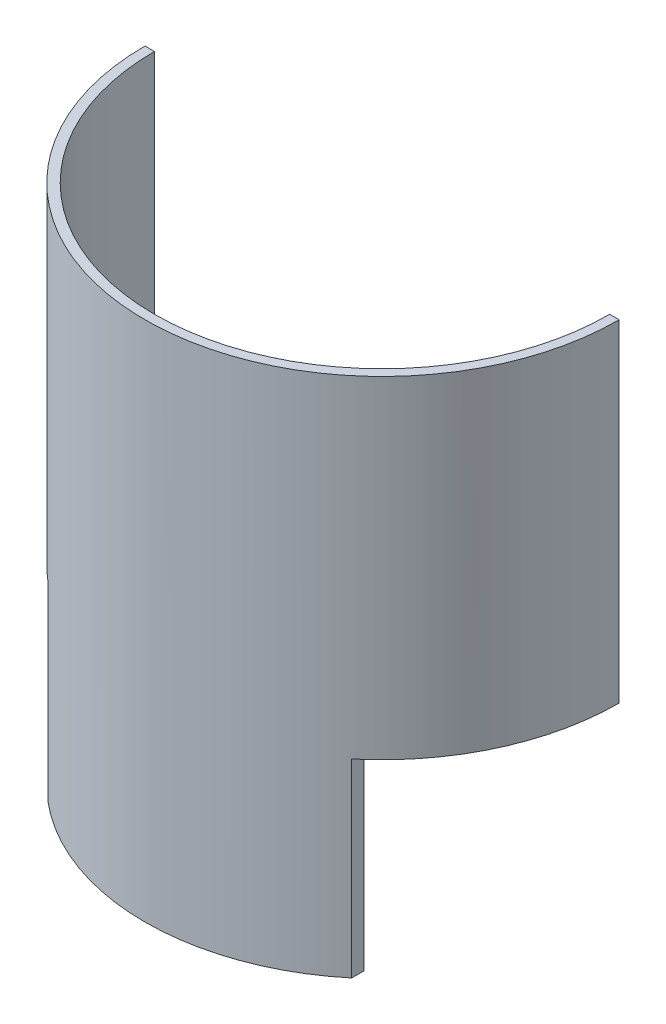
ISO-10303-21;
HEADER;
FILE_DESCRIPTION(('STEP AP214'),'2;1');
FILE_NAME('part.step','',(''),(''),'','','');
FILE_SCHEMA(('AUTOMOTIVE_DESIGN { 1 0 10303 214 1 1 1 1 }'));
ENDSEC;
DATA;
#1=APPLICATION_CONTEXT('core data for automotive mechanical design processes');
#2=APPLICATION_PROTOCOL_DEFINITION('international standard','automotive_design',2000,#1);
#3=PRODUCT_CONTEXT('',#1,'mechanical');
#4=PRODUCT('Part','Part','',(#3));
#5=PRODUCT_RELATED_PRODUCT_CATEGORY('part','',(#4));
#6=PRODUCT_DEFINITION_FORMATION('','',#4);
#7=PRODUCT_DEFINITION_CONTEXT('part definition',#1,'design');
#8=PRODUCT_DEFINITION('design','',#6,#7);
#9=PRODUCT_DEFINITION_SHAPE('','',#8);
#10=(LENGTH_UNIT() NAMED_UNIT(*) SI_UNIT(.MILLI.,.METRE.));
#11=(NAMED_UNIT(*) PLANE_ANGLE_UNIT() SI_UNIT($,.RADIAN.));
#12=(NAMED_UNIT(*) SI_UNIT($,.STERADIAN.) SOLID_ANGLE_UNIT());
#13=UNCERTAINTY_MEASURE_WITH_UNIT(LENGTH_MEASURE(1.E-05),#10,'distance_accuracy_value','');
#14=(GEOMETRIC_REPRESENTATION_CONTEXT(3) GLOBAL_UNCERTAINTY_ASSIGNED_CONTEXT((#13)) GLOBAL_UNIT_ASSIGNED_CONTEXT((#10,
#11,#12)) REPRESENTATION_CONTEXT('',''));
#15=CARTESIAN_POINT('',(0.,0.,0.));
#16=DIRECTION('',(0.,0.,1.));
#17=DIRECTION('',(1.,0.,0.));
#18=AXIS2_PLACEMENT_3D('',#15,#16,#17);
#19=CARTESIAN_POINT('',(0.,10.,0.));
#20=DIRECTION('',(0.,1.,0.));
#21=DIRECTION('',(0.,0.,1.));
#22=AXIS2_PLACEMENT_3D('',#19,#20,#21);
#23=PLANE('',#22);
#24=DIRECTION('',(0.,0.,1.));
#25=VECTOR('',#24,1.);
#26=CARTESIAN_POINT('',(8.,10.,8.94427190999916));
#27=LINE('',#26,#25);
#28=CARTESIAN_POINT('',(8.,10.,8.94427190999916));
#29=VERTEX_POINT('',#28);
#30=CARTESIAN_POINT('',(8.,10.,9.60468635614927));
#31=VERTEX_POINT('',#30);
#32=EDGE_CURVE('E123',#29,#31,#27,.T.);
#33=ORIENTED_EDGE('',*,*,#32,.F.);
#34=CARTESIAN_POINT('',(0.,10.,0.));
#35=DIRECTION('',(0.,1.,0.));
#36=DIRECTION('',(0.,0.,1.));
#37=AXIS2_PLACEMENT_3D('',#34,#35,#36);
#38=CIRCLE('',#37,12.);
#39=CARTESIAN_POINT('',(12.,10.,0.));
#40=VERTEX_POINT('',#39);
#41=EDGE_CURVE('E82',#29,#40,#38,.T.);
#42=ORIENTED_EDGE('',*,*,#41,.T.);
#43=DIRECTION('',(1.,0.,0.));
#44=VECTOR('',#43,1.);
#45=CARTESIAN_POINT('',(0.,10.,0.));
#46=LINE('',#45,#44);
#47=CARTESIAN_POINT('',(12.5,10.,0.));
#48=VERTEX_POINT('',#47);
#49=EDGE_CURVE('E128',#40,#48,#46,.T.);
#50=ORIENTED_EDGE('',*,*,#49,.T.);
#51=CARTESIAN_POINT('',(0.,10.,0.));
#52=DIRECTION('',(0.,1.,0.));
#53=DIRECTION('',(0.,0.,1.));
#54=AXIS2_PLACEMENT_3D('',#51,#52,#53);
#55=CIRCLE('',#54,12.5);
#56=EDGE_CURVE('E116',#31,#48,#55,.T.);
#57=ORIENTED_EDGE('',*,*,#56,.F.);
#58=EDGE_LOOP('',(#33,#42,#50,#57));
#59=FACE_BOUND('',#58,.T.);
#60=ADVANCED_FACE('F36',(#59),#23,.F.);
#61=CARTESIAN_POINT('',(0.,10.,0.));
#62=DIRECTION('',(0.,-1.,0.));
#63=DIRECTION('',(0.,0.,-1.));
#64=AXIS2_PLACEMENT_3D('',#61,#62,#63);
#65=CYLINDRICAL_SURFACE('',#64,12.);
#66=DIRECTION('',(0.,-1.,0.));
#67=VECTOR('',#66,1.);
#68=CARTESIAN_POINT('',(12.,27.5,0.));
#69=LINE('',#68,#67);
#70=CARTESIAN_POINT('',(12.,27.5,0.));
#71=VERTEX_POINT('',#70);
#72=EDGE_CURVE('E60',#71,#40,#69,.T.);
#73=ORIENTED_EDGE('',*,*,#72,.T.);
#74=ORIENTED_EDGE('',*,*,#41,.F.);
#75=DIRECTION('',(0.,-1.,0.));
#76=VECTOR('',#75,1.);
#77=CARTESIAN_POINT('',(8.,26.3903386862511,8.94427190999916));
#78=LINE('',#77,#76);
#79=CARTESIAN_POINT('',(8.,0.,8.94427190999916));
#80=VERTEX_POINT('',#79);
#81=EDGE_CURVE('E126',#29,#80,#78,.T.);
#82=ORIENTED_EDGE('',*,*,#81,.T.);
#83=CARTESIAN_POINT('',(0.,0.,0.));
#84=DIRECTION('',(0.,-1.,0.));
#85=DIRECTION('',(0.,0.,-1.));
#86=AXIS2_PLACEMENT_3D('',#83,#84,#85);
#87=CIRCLE('',#86,12.);
#88=CARTESIAN_POINT('',(-8.,0.,8.94427190999916));
#89=VERTEX_POINT('',#88);
#90=EDGE_CURVE('E157',#80,#89,#87,.T.);
#91=ORIENTED_EDGE('',*,*,#90,.T.);
#92=DIRECTION('',(0.,-1.,0.));
#93=VECTOR('',#92,1.);
#94=CARTESIAN_POINT('',(-8.,26.3903386862511,8.94427190999916));
#95=LINE('',#94,#93);
#96=CARTESIAN_POINT('',(-8.,10.,8.94427190999916));
#97=VERTEX_POINT('',#96);
#98=EDGE_CURVE('E156',#97,#89,#95,.T.);
#99=ORIENTED_EDGE('',*,*,#98,.F.);
#100=CARTESIAN_POINT('',(-12.,10.,0.));
#101=VERTEX_POINT('',#100);
#102=EDGE_CURVE('E133',#101,#97,#38,.T.);
#103=ORIENTED_EDGE('',*,*,#102,.F.);
#104=DIRECTION('',(0.,-1.,0.));
#105=VECTOR('',#104,1.);
#106=CARTESIAN_POINT('',(-12.,27.5,0.));
#107=LINE('',#106,#105);
#108=CARTESIAN_POINT('',(-12.,27.5,0.));
#109=VERTEX_POINT('',#108);
#110=EDGE_CURVE('E11',#109,#101,#107,.T.);
#111=ORIENTED_EDGE('',*,*,#110,.F.);
#112=CARTESIAN_POINT('',(0.,27.5,0.));
#113=DIRECTION('',(0.,1.,0.));
#114=DIRECTION('',(0.,0.,1.));
#115=AXIS2_PLACEMENT_3D('',#112,#113,#114);
#116=CIRCLE('',#115,12.);
#117=EDGE_CURVE('E138',#109,#71,#116,.T.);
#118=ORIENTED_EDGE('',*,*,#117,.T.);
#119=EDGE_LOOP('',(#73,#74,#82,#91,#99,#103,#111,#118));
#120=FACE_BOUND('',#119,.T.);
#121=ADVANCED_FACE('F38',(#120),#65,.F.);
#122=CARTESIAN_POINT('',(0.,10.,0.));
#123=DIRECTION('',(0.,-1.,0.));
#124=DIRECTION('',(0.,0.,-1.));
#125=AXIS2_PLACEMENT_3D('',#122,#123,#124);
#126=CYLINDRICAL_SURFACE('',#125,12.5);
#127=CARTESIAN_POINT('',(-12.5,10.,0.));
#128=VERTEX_POINT('',#127);
#129=CARTESIAN_POINT('',(-8.,10.,9.60468635614927));
#130=VERTEX_POINT('',#129);
#131=EDGE_CURVE('E129',#128,#130,#55,.T.);
#132=ORIENTED_EDGE('',*,*,#131,.T.);
#133=DIRECTION('',(0.,-1.,0.));
#134=VECTOR('',#133,1.);
#135=CARTESIAN_POINT('',(-8.,26.3903386862511,9.60468635614927));
#136=LINE('',#135,#134);
#137=CARTESIAN_POINT('',(-8.,0.,9.60468635614927));
#138=VERTEX_POINT('',#137);
#139=EDGE_CURVE('E51',#130,#138,#136,.T.);
#140=ORIENTED_EDGE('',*,*,#139,.T.);
#141=CARTESIAN_POINT('',(0.,0.,0.));
#142=DIRECTION('',(0.,-1.,0.));
#143=DIRECTION('',(0.,0.,-1.));
#144=AXIS2_PLACEMENT_3D('',#141,#142,#143);
#145=CIRCLE('',#144,12.5);
#146=CARTESIAN_POINT('',(8.,0.,9.60468635614927));
#147=VERTEX_POINT('',#146);
#148=EDGE_CURVE('E119',#147,#138,#145,.T.);
#149=ORIENTED_EDGE('',*,*,#148,.F.);
#150=DIRECTION('',(0.,-1.,0.));
#151=VECTOR('',#150,1.);
#152=CARTESIAN_POINT('',(8.,26.3903386862511,9.60468635614927));
#153=LINE('',#152,#151);
#154=EDGE_CURVE('E110',#31,#147,#153,.T.);
#155=ORIENTED_EDGE('',*,*,#154,.F.);
#156=ORIENTED_EDGE('',*,*,#56,.T.);
#157=DIRECTION('',(0.,-1.,0.));
#158=VECTOR('',#157,1.);
#159=CARTESIAN_POINT('',(12.5,27.5,0.));
#160=LINE('',#159,#158);
#161=CARTESIAN_POINT('',(12.5,27.5,0.));
#162=VERTEX_POINT('',#161);
#163=EDGE_CURVE('E140',#162,#48,#160,.T.);
#164=ORIENTED_EDGE('',*,*,#163,.F.);
#165=CARTESIAN_POINT('',(0.,27.5,0.));
#166=DIRECTION('',(0.,1.,0.));
#167=DIRECTION('',(0.,0.,1.));
#168=AXIS2_PLACEMENT_3D('',#165,#166,#167);
#169=CIRCLE('',#168,12.5);
#170=CARTESIAN_POINT('',(-12.5,27.5,0.));
#171=VERTEX_POINT('',#170);
#172=EDGE_CURVE('E144',#171,#162,#169,.T.);
#173=ORIENTED_EDGE('',*,*,#172,.F.);
#174=DIRECTION('',(0.,-1.,0.));
#175=VECTOR('',#174,1.);
#176=CARTESIAN_POINT('',(-12.5,27.5,0.));
#177=LINE('',#176,#175);
#178=EDGE_CURVE('E44',#171,#128,#177,.T.);
#179=ORIENTED_EDGE('',*,*,#178,.T.);
#180=EDGE_LOOP('',(#132,#140,#149,#155,#156,#164,#173,#179));
#181=FACE_BOUND('',#180,.T.);
#182=ADVANCED_FACE('F113',(#181),#126,.T.);
#183=ORIENTED_EDGE('',*,*,#102,.T.);
#184=DIRECTION('',(0.,0.,1.));
#185=VECTOR('',#184,1.);
#186=CARTESIAN_POINT('',(-8.,10.,8.94427190999916));
#187=LINE('',#186,#185);
#188=EDGE_CURVE('E152',#97,#130,#187,.T.);
#189=ORIENTED_EDGE('',*,*,#188,.T.);
#190=ORIENTED_EDGE('',*,*,#131,.F.);
#191=DIRECTION('',(1.,0.,0.));
#192=VECTOR('',#191,1.);
#193=CARTESIAN_POINT('',(0.,10.,0.));
#194=LINE('',#193,#192);
#195=EDGE_CURVE('E130',#128,#101,#194,.T.);
#196=ORIENTED_EDGE('',*,*,#195,.T.);
#197=EDGE_LOOP('',(#183,#189,#190,#196));
#198=FACE_BOUND('',#197,.T.);
#199=ADVANCED_FACE('F151',(#198),#23,.F.);
#200=CARTESIAN_POINT('',(0.,27.5,0.));
#201=DIRECTION('',(0.,0.,-1.));
#202=DIRECTION('',(-1.,0.,0.));
#203=AXIS2_PLACEMENT_3D('',#200,#201,#202);
#204=PLANE('',#203);
#205=ORIENTED_EDGE('',*,*,#195,.F.);
#206=ORIENTED_EDGE('',*,*,#178,.F.);
#207=DIRECTION('',(1.,0.,0.));
#208=VECTOR('',#207,1.);
#209=CARTESIAN_POINT('',(0.,27.5,0.));
#210=LINE('',#209,#208);
#211=EDGE_CURVE('E154',#171,#109,#210,.T.);
#212=ORIENTED_EDGE('',*,*,#211,.T.);
#213=ORIENTED_EDGE('',*,*,#110,.T.);
#214=EDGE_LOOP('',(#205,#206,#212,#213));
#215=FACE_BOUND('',#214,.T.);
#216=ADVANCED_FACE('F153',(#215),#204,.T.);
#217=CARTESIAN_POINT('',(0.,27.5,0.));
#218=DIRECTION('',(0.,0.,-1.));
#219=DIRECTION('',(-1.,0.,0.));
#220=AXIS2_PLACEMENT_3D('',#217,#218,#219);
#221=PLANE('',#220);
#222=ORIENTED_EDGE('',*,*,#49,.F.);
#223=ORIENTED_EDGE('',*,*,#72,.F.);
#224=DIRECTION('',(1.,0.,0.));
#225=VECTOR('',#224,1.);
#226=CARTESIAN_POINT('',(0.,27.5,0.));
#227=LINE('',#226,#225);
#228=EDGE_CURVE('E141',#71,#162,#227,.T.);
#229=ORIENTED_EDGE('',*,*,#228,.T.);
#230=ORIENTED_EDGE('',*,*,#163,.T.);
#231=EDGE_LOOP('',(#222,#223,#229,#230));
#232=FACE_BOUND('',#231,.T.);
#233=ADVANCED_FACE('F177',(#232),#221,.T.);
#234=CARTESIAN_POINT('',(0.,27.5,0.));
#235=DIRECTION('',(0.,1.,0.));
#236=DIRECTION('',(0.,0.,1.));
#237=AXIS2_PLACEMENT_3D('',#234,#235,#236);
#238=PLANE('',#237);
#239=ORIENTED_EDGE('',*,*,#117,.F.);
#240=ORIENTED_EDGE('',*,*,#211,.F.);
#241=ORIENTED_EDGE('',*,*,#172,.T.);
#242=ORIENTED_EDGE('',*,*,#228,.F.);
#243=EDGE_LOOP('',(#239,#240,#241,#242));
#244=FACE_BOUND('',#243,.T.);
#245=ADVANCED_FACE('F179',(#244),#238,.T.);
#246=CARTESIAN_POINT('',(0.,0.,0.));
#247=DIRECTION('',(0.,-1.,0.));
#248=DIRECTION('',(0.,0.,-1.));
#249=AXIS2_PLACEMENT_3D('',#246,#247,#248);
#250=PLANE('',#249);
#251=ORIENTED_EDGE('',*,*,#90,.F.);
#252=DIRECTION('',(0.,0.,1.));
#253=VECTOR('',#252,1.);
#254=CARTESIAN_POINT('',(8.,0.,8.94427190999916));
#255=LINE('',#254,#253);
#256=EDGE_CURVE('E167',#80,#147,#255,.T.);
#257=ORIENTED_EDGE('',*,*,#256,.T.);
#258=ORIENTED_EDGE('',*,*,#148,.T.);
#259=DIRECTION('',(0.,0.,1.));
#260=VECTOR('',#259,1.);
#261=CARTESIAN_POINT('',(-8.,0.,8.94427190999916));
#262=LINE('',#261,#260);
#263=EDGE_CURVE('E163',#89,#138,#262,.T.);
#264=ORIENTED_EDGE('',*,*,#263,.F.);
#265=EDGE_LOOP('',(#251,#257,#258,#264));
#266=FACE_BOUND('',#265,.T.);
#267=ADVANCED_FACE('F174',(#266),#250,.T.);
#268=CARTESIAN_POINT('',(8.,26.3903386862511,8.94427190999916));
#269=DIRECTION('',(1.,0.,0.));
#270=DIRECTION('',(0.,0.,-1.));
#271=AXIS2_PLACEMENT_3D('',#268,#269,#270);
#272=PLANE('',#271);
#273=ORIENTED_EDGE('',*,*,#81,.F.);
#274=ORIENTED_EDGE('',*,*,#32,.T.);
#275=ORIENTED_EDGE('',*,*,#154,.T.);
#276=ORIENTED_EDGE('',*,*,#256,.F.);
#277=EDGE_LOOP('',(#273,#274,#275,#276));
#278=FACE_BOUND('',#277,.T.);
#279=ADVANCED_FACE('F125',(#278),#272,.T.);
#280=CARTESIAN_POINT('',(-8.,26.3903386862511,8.94427190999916));
#281=DIRECTION('',(1.,0.,0.));
#282=DIRECTION('',(0.,0.,-1.));
#283=AXIS2_PLACEMENT_3D('',#280,#281,#282);
#284=PLANE('',#283);
#285=ORIENTED_EDGE('',*,*,#188,.F.);
#286=ORIENTED_EDGE('',*,*,#98,.T.);
#287=ORIENTED_EDGE('',*,*,#263,.T.);
#288=ORIENTED_EDGE('',*,*,#139,.F.);
#289=EDGE_LOOP('',(#285,#286,#287,#288));
#290=FACE_BOUND('',#289,.T.);
#291=ADVANCED_FACE('F277',(#290),#284,.F.);
#292=CLOSED_SHELL('',(#60,#121,#182,#199,#216,#233,#245,#267,#279,#291));
#293=MANIFOLD_SOLID_BREP('B2',#292);
#294=ADVANCED_BREP_SHAPE_REPRESENTATION('',(#18,#293),#14);
#295=SHAPE_DEFINITION_REPRESENTATION(#9,#294);
ENDSEC;
END-ISO-10303-21;
